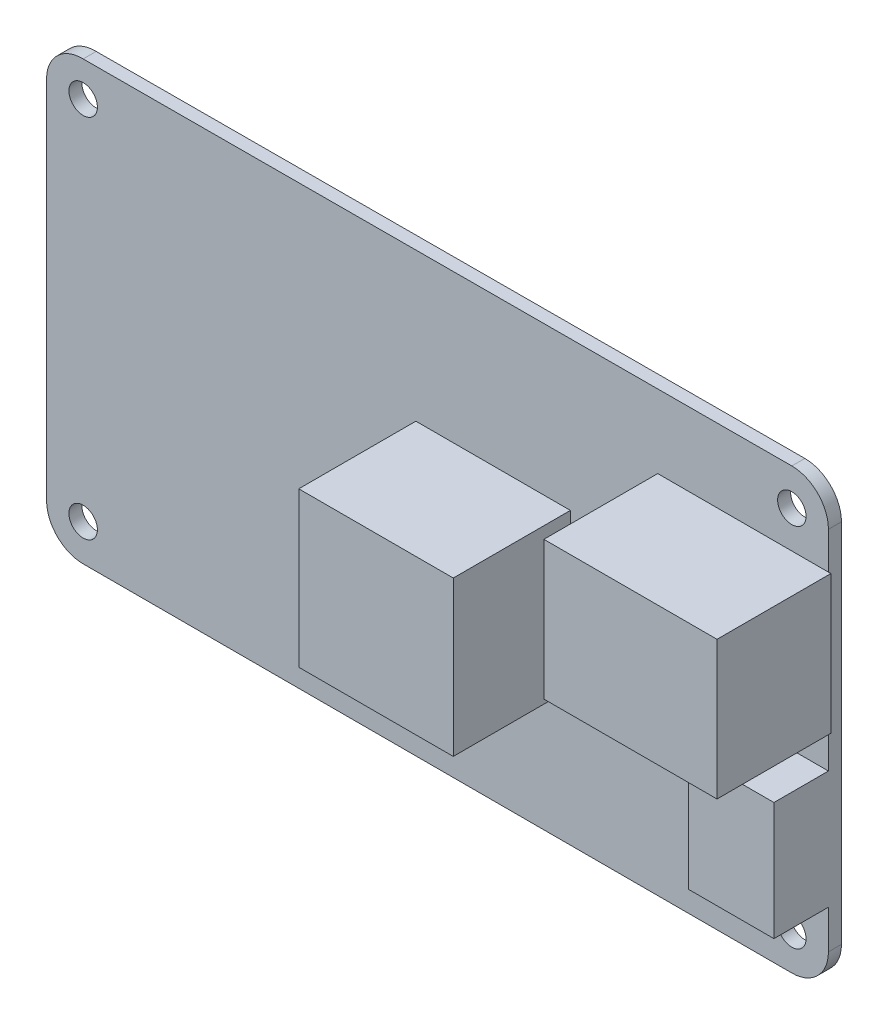
ISO-10303-21;
HEADER;
FILE_DESCRIPTION(('STEP AP214'),'2;1');
FILE_NAME('part.step','',(''),(''),'','','');
FILE_SCHEMA(('AUTOMOTIVE_DESIGN { 1 0 10303 214 1 1 1 1 }'));
ENDSEC;
DATA;
#1=APPLICATION_CONTEXT('core data for automotive mechanical design processes');
#2=APPLICATION_PROTOCOL_DEFINITION('international standard','automotive_design',2000,#1);
#3=PRODUCT_CONTEXT('',#1,'mechanical');
#4=PRODUCT('Part','Part','',(#3));
#5=PRODUCT_RELATED_PRODUCT_CATEGORY('part','',(#4));
#6=PRODUCT_DEFINITION_FORMATION('','',#4);
#7=PRODUCT_DEFINITION_CONTEXT('part definition',#1,'design');
#8=PRODUCT_DEFINITION('design','',#6,#7);
#9=PRODUCT_DEFINITION_SHAPE('','',#8);
#10=(LENGTH_UNIT() NAMED_UNIT(*) SI_UNIT(.MILLI.,.METRE.));
#11=(NAMED_UNIT(*) PLANE_ANGLE_UNIT() SI_UNIT($,.RADIAN.));
#12=(NAMED_UNIT(*) SI_UNIT($,.STERADIAN.) SOLID_ANGLE_UNIT());
#13=UNCERTAINTY_MEASURE_WITH_UNIT(LENGTH_MEASURE(1.E-05),#10,'distance_accuracy_value','');
#14=(GEOMETRIC_REPRESENTATION_CONTEXT(3) GLOBAL_UNCERTAINTY_ASSIGNED_CONTEXT((#13)) GLOBAL_UNIT_ASSIGNED_CONTEXT((#10,
#11,#12)) REPRESENTATION_CONTEXT('',''));
#15=CARTESIAN_POINT('',(0.,0.,0.));
#16=DIRECTION('',(0.,0.,1.));
#17=DIRECTION('',(1.,0.,0.));
#18=AXIS2_PLACEMENT_3D('',#15,#16,#17);
#19=CARTESIAN_POINT('',(87.3508295780182,-136.451333310687,-29.8283937748464));
#20=DIRECTION('',(0.,0.,1.));
#21=DIRECTION('',(1.,0.,0.));
#22=AXIS2_PLACEMENT_3D('',#19,#20,#21);
#23=PLANE('',#22);
#24=CARTESIAN_POINT('',(0.210829578018185,-91.4513333106873,-29.8283937748464));
#25=DIRECTION('',(0.,0.,1.));
#26=DIRECTION('',(1.,0.,0.));
#27=AXIS2_PLACEMENT_3D('',#24,#25,#26);
#28=CIRCLE('',#27,1.75);
#29=CARTESIAN_POINT('',(1.96082957801818,-91.4513333106873,-29.8283937748464));
#30=VERTEX_POINT('',#29);
#31=EDGE_CURVE('E279',#30,#30,#28,.T.);
#32=ORIENTED_EDGE('',*,*,#31,.F.);
#33=EDGE_LOOP('',(#32));
#34=FACE_BOUND('',#33,.T.);
#35=CARTESIAN_POINT('',(87.3508295780182,-136.451333310687,-29.8283937748464));
#36=DIRECTION('',(0.,0.,1.));
#37=DIRECTION('',(1.,0.,0.));
#38=AXIS2_PLACEMENT_3D('',#35,#36,#37);
#39=CIRCLE('',#38,1.75);
#40=CARTESIAN_POINT('',(89.1008295780182,-136.451333310687,-29.8283937748464));
#41=VERTEX_POINT('',#40);
#42=EDGE_CURVE('E291',#41,#41,#39,.T.);
#43=ORIENTED_EDGE('',*,*,#42,.F.);
#44=EDGE_LOOP('',(#43));
#45=FACE_BOUND('',#44,.T.);
#46=CARTESIAN_POINT('',(87.3508295780182,-91.4513333106873,-29.8283937748464));
#47=DIRECTION('',(0.,0.,1.));
#48=DIRECTION('',(1.,0.,0.));
#49=AXIS2_PLACEMENT_3D('',#46,#47,#48);
#50=CIRCLE('',#49,1.75);
#51=CARTESIAN_POINT('',(89.1008295780182,-91.4513333106873,-29.8283937748464));
#52=VERTEX_POINT('',#51);
#53=EDGE_CURVE('E285',#52,#52,#50,.T.);
#54=ORIENTED_EDGE('',*,*,#53,.F.);
#55=EDGE_LOOP('',(#54));
#56=FACE_BOUND('',#55,.T.);
#57=CARTESIAN_POINT('',(0.210829578018185,-136.451333310687,-29.8283937748464));
#58=DIRECTION('',(0.,0.,1.));
#59=DIRECTION('',(1.,0.,0.));
#60=AXIS2_PLACEMENT_3D('',#57,#58,#59);
#61=CIRCLE('',#60,1.75);
#62=CARTESIAN_POINT('',(1.96082957801819,-136.451333310687,-29.8283937748464));
#63=VERTEX_POINT('',#62);
#64=EDGE_CURVE('E273',#63,#63,#61,.T.);
#65=ORIENTED_EDGE('',*,*,#64,.F.);
#66=EDGE_LOOP('',(#65));
#67=FACE_BOUND('',#66,.T.);
#68=DIRECTION('',(0.,-1.,0.));
#69=VECTOR('',#68,1.);
#70=CARTESIAN_POINT('',(81.3508295780182,-131.691333310687,-29.8283937748464));
#71=LINE('',#70,#69);
#72=CARTESIAN_POINT('',(81.3508295780182,-117.191333310687,-29.8283937748464));
#73=VERTEX_POINT('',#72);
#74=CARTESIAN_POINT('',(81.3508295780182,-131.691333310687,-29.8283937748464));
#75=VERTEX_POINT('',#74);
#76=EDGE_CURVE('E64',#73,#75,#71,.T.);
#77=ORIENTED_EDGE('',*,*,#76,.F.);
#78=DIRECTION('',(-1.,0.,0.));
#79=VECTOR('',#78,1.);
#80=CARTESIAN_POINT('',(91.8508295780181,-117.191333310687,-29.8283937748464));
#81=LINE('',#80,#79);
#82=CARTESIAN_POINT('',(91.8508295780181,-117.191333310687,-29.8283937748464));
#83=VERTEX_POINT('',#82);
#84=EDGE_CURVE('E210',#83,#73,#81,.T.);
#85=ORIENTED_EDGE('',*,*,#84,.F.);
#86=DIRECTION('',(0.,1.,0.));
#87=VECTOR('',#86,1.);
#88=CARTESIAN_POINT('',(91.8508295780182,-91.4513333106873,-29.8283937748464));
#89=LINE('',#88,#87);
#90=CARTESIAN_POINT('',(91.8508295780182,-113.021333310687,-29.8283937748464));
#91=VERTEX_POINT('',#90);
#92=EDGE_CURVE('E305',#83,#91,#89,.T.);
#93=ORIENTED_EDGE('',*,*,#92,.T.);
#94=DIRECTION('',(1.,0.,0.));
#95=VECTOR('',#94,1.);
#96=CARTESIAN_POINT('',(70.8608295780182,-113.021333310687,-29.8283937748464));
#97=LINE('',#96,#95);
#98=CARTESIAN_POINT('',(70.8608295780182,-113.021333310687,-29.8283937748464));
#99=VERTEX_POINT('',#98);
#100=EDGE_CURVE('E255',#99,#91,#97,.T.);
#101=ORIENTED_EDGE('',*,*,#100,.F.);
#102=DIRECTION('',(0.,-1.,0.));
#103=VECTOR('',#102,1.);
#104=CARTESIAN_POINT('',(70.8608295780182,-113.021333310687,-29.8283937748464));
#105=LINE('',#104,#103);
#106=CARTESIAN_POINT('',(70.8608295780182,-96.0113333106873,-29.8283937748464));
#107=VERTEX_POINT('',#106);
#108=EDGE_CURVE('E241',#107,#99,#105,.T.);
#109=ORIENTED_EDGE('',*,*,#108,.F.);
#110=DIRECTION('',(-1.,0.,0.));
#111=VECTOR('',#110,1.);
#112=CARTESIAN_POINT('',(70.8608295780182,-96.0113333106873,-29.8283937748464));
#113=LINE('',#112,#111);
#114=CARTESIAN_POINT('',(91.8508295780182,-96.0113333106873,-29.8283937748464));
#115=VERTEX_POINT('',#114);
#116=EDGE_CURVE('E11',#115,#107,#113,.T.);
#117=ORIENTED_EDGE('',*,*,#116,.F.);
#118=CARTESIAN_POINT('',(91.8508295780182,-91.4513333106873,-29.8283937748464));
#119=VERTEX_POINT('',#118);
#120=EDGE_CURVE('E300',#115,#119,#89,.T.);
#121=ORIENTED_EDGE('',*,*,#120,.T.);
#122=CARTESIAN_POINT('',(87.3508295780182,-91.4513333106873,-29.8283937748464));
#123=DIRECTION('',(0.,0.,1.));
#124=DIRECTION('',(-1.,0.,0.));
#125=AXIS2_PLACEMENT_3D('',#122,#123,#124);
#126=CIRCLE('',#125,4.49999999999998);
#127=CARTESIAN_POINT('',(87.3508295780182,-86.9513333106873,-29.8283937748464));
#128=VERTEX_POINT('',#127);
#129=EDGE_CURVE('E304',#119,#128,#126,.T.);
#130=ORIENTED_EDGE('',*,*,#129,.T.);
#131=DIRECTION('',(-0.999996529366138,-0.00263462628827098,0.));
#132=VECTOR('',#131,1.);
#133=CARTESIAN_POINT('',(87.3508295780182,-86.9513333106873,-29.8283937748464));
#134=LINE('',#133,#132);
#135=CARTESIAN_POINT('',(0.210829578018185,-87.1809154422427,-29.8283937748464));
#136=VERTEX_POINT('',#135);
#137=EDGE_CURVE('E308',#128,#136,#134,.T.);
#138=ORIENTED_EDGE('',*,*,#137,.T.);
#139=CARTESIAN_POINT('',(0.0960385122404962,-91.5661243764651,-29.8283937748464));
#140=DIRECTION('',(0.,0.,1.));
#141=DIRECTION('',(-1.,0.,0.));
#142=AXIS2_PLACEMENT_3D('',#139,#140,#141);
#143=CIRCLE('',#142,4.38671111261792);
#144=CARTESIAN_POINT('',(-4.28917042198182,-91.4513333106873,-29.8283937748464));
#145=VERTEX_POINT('',#144);
#146=EDGE_CURVE('E310',#136,#145,#143,.T.);
#147=ORIENTED_EDGE('',*,*,#146,.T.);
#148=DIRECTION('',(0.,-1.,0.));
#149=VECTOR('',#148,1.);
#150=CARTESIAN_POINT('',(-4.28917042198179,-136.451333310687,-29.8283937748464));
#151=LINE('',#150,#149);
#152=CARTESIAN_POINT('',(-4.28917042198178,-136.451333310687,-29.8283937748464));
#153=VERTEX_POINT('',#152);
#154=EDGE_CURVE('E312',#145,#153,#151,.T.);
#155=ORIENTED_EDGE('',*,*,#154,.T.);
#156=CARTESIAN_POINT('',(0.21082957801823,-136.451333310687,-29.8283937748464));
#157=DIRECTION('',(0.,0.,1.));
#158=DIRECTION('',(1.,0.,0.));
#159=AXIS2_PLACEMENT_3D('',#156,#157,#158);
#160=CIRCLE('',#159,4.50000000000001);
#161=CARTESIAN_POINT('',(0.210829578018185,-140.951333310687,-29.8283937748464));
#162=VERTEX_POINT('',#161);
#163=EDGE_CURVE('E314',#153,#162,#160,.T.);
#164=ORIENTED_EDGE('',*,*,#163,.T.);
#165=DIRECTION('',(1.,0.,0.));
#166=VECTOR('',#165,1.);
#167=CARTESIAN_POINT('',(87.3508295780182,-140.951333310687,-29.8283937748464));
#168=LINE('',#167,#166);
#169=CARTESIAN_POINT('',(87.3508295780182,-140.951333310687,-29.8283937748464));
#170=VERTEX_POINT('',#169);
#171=EDGE_CURVE('E316',#162,#170,#168,.T.);
#172=ORIENTED_EDGE('',*,*,#171,.T.);
#173=CARTESIAN_POINT('',(87.3508295780182,-136.451333310687,-29.8283937748464));
#174=DIRECTION('',(0.,0.,1.));
#175=DIRECTION('',(1.,0.,0.));
#176=AXIS2_PLACEMENT_3D('',#173,#174,#175);
#177=CIRCLE('',#176,4.49999999999998);
#178=CARTESIAN_POINT('',(91.8508295780181,-136.451333310687,-29.8283937748464));
#179=VERTEX_POINT('',#178);
#180=EDGE_CURVE('E297',#170,#179,#177,.T.);
#181=ORIENTED_EDGE('',*,*,#180,.T.);
#182=CARTESIAN_POINT('',(91.8508295780181,-131.691333310687,-29.8283937748464));
#183=VERTEX_POINT('',#182);
#184=EDGE_CURVE('E302',#179,#183,#89,.T.);
#185=ORIENTED_EDGE('',*,*,#184,.T.);
#186=DIRECTION('',(1.,0.,0.));
#187=VECTOR('',#186,1.);
#188=CARTESIAN_POINT('',(91.8508295780181,-131.691333310687,-29.8283937748464));
#189=LINE('',#188,#187);
#190=EDGE_CURVE('E220',#75,#183,#189,.T.);
#191=ORIENTED_EDGE('',*,*,#190,.F.);
#192=EDGE_LOOP('',(#77,#85,#93,#101,#109,#117,#121,#130,#138,#147,#155,#164,#172,#181,#185,#191));
#193=FACE_BOUND('',#192,.T.);
#194=DIRECTION('',(-1.,0.,0.));
#195=VECTOR('',#194,1.);
#196=CARTESIAN_POINT('',(60.1208295780182,-105.302468160602,-29.8283937748464));
#197=LINE('',#196,#195);
#198=CARTESIAN_POINT('',(60.1208295780182,-105.302468160602,-29.8283937748464));
#199=VERTEX_POINT('',#198);
#200=CARTESIAN_POINT('',(41.1208295780182,-105.302468160602,-29.8283937748464));
#201=VERTEX_POINT('',#200);
#202=EDGE_CURVE('E656',#199,#201,#197,.T.);
#203=ORIENTED_EDGE('',*,*,#202,.F.);
#204=DIRECTION('',(0.,1.,0.));
#205=VECTOR('',#204,1.);
#206=CARTESIAN_POINT('',(60.1208295780182,-124.302468160602,-29.8283937748464));
#207=LINE('',#206,#205);
#208=CARTESIAN_POINT('',(60.1208295780182,-124.302468160602,-29.8283937748464));
#209=VERTEX_POINT('',#208);
#210=EDGE_CURVE('E208',#209,#199,#207,.T.);
#211=ORIENTED_EDGE('',*,*,#210,.F.);
#212=DIRECTION('',(1.,0.,0.));
#213=VECTOR('',#212,1.);
#214=CARTESIAN_POINT('',(60.1208295780182,-124.302468160602,-29.8283937748464));
#215=LINE('',#214,#213);
#216=CARTESIAN_POINT('',(41.1208295780182,-124.302468160602,-29.8283937748464));
#217=VERTEX_POINT('',#216);
#218=EDGE_CURVE('E204',#217,#209,#215,.T.);
#219=ORIENTED_EDGE('',*,*,#218,.F.);
#220=DIRECTION('',(0.,-1.,0.));
#221=VECTOR('',#220,1.);
#222=CARTESIAN_POINT('',(41.1208295780182,-124.302468160602,-29.8283937748464));
#223=LINE('',#222,#221);
#224=EDGE_CURVE('E653',#201,#217,#223,.T.);
#225=ORIENTED_EDGE('',*,*,#224,.F.);
#226=EDGE_LOOP('',(#203,#211,#219,#225));
#227=FACE_BOUND('',#226,.T.);
#228=ADVANCED_FACE('F39',(#34,#45,#56,#67,#193,#227),#23,.T.);
#229=CARTESIAN_POINT('',(87.3508295780182,-136.451333310687,-31.4283937748464));
#230=DIRECTION('',(0.,0.,1.));
#231=DIRECTION('',(1.,0.,0.));
#232=AXIS2_PLACEMENT_3D('',#229,#230,#231);
#233=PLANE('',#232);
#234=CARTESIAN_POINT('',(87.3508295780182,-136.451333310687,-31.4283937748464));
#235=DIRECTION('',(0.,0.,1.));
#236=DIRECTION('',(1.,0.,0.));
#237=AXIS2_PLACEMENT_3D('',#234,#235,#236);
#238=CIRCLE('',#237,4.49999999999998);
#239=CARTESIAN_POINT('',(87.3508295780182,-140.951333310687,-31.4283937748464));
#240=VERTEX_POINT('',#239);
#241=CARTESIAN_POINT('',(91.8508295780181,-136.451333310687,-31.4283937748464));
#242=VERTEX_POINT('',#241);
#243=EDGE_CURVE('E294',#240,#242,#238,.T.);
#244=ORIENTED_EDGE('',*,*,#243,.F.);
#245=DIRECTION('',(1.,0.,0.));
#246=VECTOR('',#245,1.);
#247=CARTESIAN_POINT('',(87.3508295780182,-140.951333310687,-31.4283937748464));
#248=LINE('',#247,#246);
#249=CARTESIAN_POINT('',(0.210829578018185,-140.951333310687,-31.4283937748464));
#250=VERTEX_POINT('',#249);
#251=EDGE_CURVE('E301',#250,#240,#248,.T.);
#252=ORIENTED_EDGE('',*,*,#251,.F.);
#253=CARTESIAN_POINT('',(0.21082957801823,-136.451333310687,-31.4283937748464));
#254=DIRECTION('',(0.,0.,1.));
#255=DIRECTION('',(1.,0.,0.));
#256=AXIS2_PLACEMENT_3D('',#253,#254,#255);
#257=CIRCLE('',#256,4.50000000000001);
#258=CARTESIAN_POINT('',(-4.28917042198178,-136.451333310687,-31.4283937748464));
#259=VERTEX_POINT('',#258);
#260=EDGE_CURVE('E331',#259,#250,#257,.T.);
#261=ORIENTED_EDGE('',*,*,#260,.F.);
#262=DIRECTION('',(0.,-1.,0.));
#263=VECTOR('',#262,1.);
#264=CARTESIAN_POINT('',(-4.28917042198179,-136.451333310687,-31.4283937748464));
#265=LINE('',#264,#263);
#266=CARTESIAN_POINT('',(-4.28917042198182,-91.4513333106873,-31.4283937748464));
#267=VERTEX_POINT('',#266);
#268=EDGE_CURVE('E329',#267,#259,#265,.T.);
#269=ORIENTED_EDGE('',*,*,#268,.F.);
#270=CARTESIAN_POINT('',(0.0960385122404962,-91.5661243764651,-31.4283937748464));
#271=DIRECTION('',(0.,0.,1.));
#272=DIRECTION('',(-1.,0.,0.));
#273=AXIS2_PLACEMENT_3D('',#270,#271,#272);
#274=CIRCLE('',#273,4.38671111261792);
#275=CARTESIAN_POINT('',(0.210829578018185,-87.1809154422427,-31.4283937748464));
#276=VERTEX_POINT('',#275);
#277=EDGE_CURVE('E327',#276,#267,#274,.T.);
#278=ORIENTED_EDGE('',*,*,#277,.F.);
#279=DIRECTION('',(-0.999996529366138,-0.00263462628827098,0.));
#280=VECTOR('',#279,1.);
#281=CARTESIAN_POINT('',(87.3508295780182,-86.9513333106873,-31.4283937748464));
#282=LINE('',#281,#280);
#283=CARTESIAN_POINT('',(87.3508295780182,-86.9513333106873,-31.4283937748464));
#284=VERTEX_POINT('',#283);
#285=EDGE_CURVE('E325',#284,#276,#282,.T.);
#286=ORIENTED_EDGE('',*,*,#285,.F.);
#287=CARTESIAN_POINT('',(87.3508295780182,-91.4513333106873,-31.4283937748464));
#288=DIRECTION('',(0.,0.,1.));
#289=DIRECTION('',(-1.,0.,0.));
#290=AXIS2_PLACEMENT_3D('',#287,#288,#289);
#291=CIRCLE('',#290,4.49999999999998);
#292=CARTESIAN_POINT('',(91.8508295780182,-91.4513333106873,-31.4283937748464));
#293=VERTEX_POINT('',#292);
#294=EDGE_CURVE('E323',#293,#284,#291,.T.);
#295=ORIENTED_EDGE('',*,*,#294,.F.);
#296=DIRECTION('',(0.,1.,0.));
#297=VECTOR('',#296,1.);
#298=CARTESIAN_POINT('',(91.8508295780182,-91.4513333106873,-31.4283937748464));
#299=LINE('',#298,#297);
#300=EDGE_CURVE('E321',#242,#293,#299,.T.);
#301=ORIENTED_EDGE('',*,*,#300,.F.);
#302=EDGE_LOOP('',(#244,#252,#261,#269,#278,#286,#295,#301));
#303=FACE_BOUND('',#302,.T.);
#304=CARTESIAN_POINT('',(87.3508295780182,-136.451333310687,-31.4283937748464));
#305=DIRECTION('',(0.,0.,1.));
#306=DIRECTION('',(1.,0.,0.));
#307=AXIS2_PLACEMENT_3D('',#304,#305,#306);
#308=CIRCLE('',#307,1.75);
#309=CARTESIAN_POINT('',(89.1008295780182,-136.451333310687,-31.4283937748464));
#310=VERTEX_POINT('',#309);
#311=EDGE_CURVE('E288',#310,#310,#308,.T.);
#312=ORIENTED_EDGE('',*,*,#311,.T.);
#313=EDGE_LOOP('',(#312));
#314=FACE_BOUND('',#313,.T.);
#315=CARTESIAN_POINT('',(87.3508295780182,-91.4513333106873,-31.4283937748464));
#316=DIRECTION('',(0.,0.,1.));
#317=DIRECTION('',(1.,0.,0.));
#318=AXIS2_PLACEMENT_3D('',#315,#316,#317);
#319=CIRCLE('',#318,1.75);
#320=CARTESIAN_POINT('',(89.1008295780182,-91.4513333106873,-31.4283937748464));
#321=VERTEX_POINT('',#320);
#322=EDGE_CURVE('E282',#321,#321,#319,.T.);
#323=ORIENTED_EDGE('',*,*,#322,.T.);
#324=EDGE_LOOP('',(#323));
#325=FACE_BOUND('',#324,.T.);
#326=CARTESIAN_POINT('',(0.210829578018185,-91.4513333106873,-31.4283937748464));
#327=DIRECTION('',(0.,0.,1.));
#328=DIRECTION('',(1.,0.,0.));
#329=AXIS2_PLACEMENT_3D('',#326,#327,#328);
#330=CIRCLE('',#329,1.75);
#331=CARTESIAN_POINT('',(1.96082957801818,-91.4513333106873,-31.4283937748464));
#332=VERTEX_POINT('',#331);
#333=EDGE_CURVE('E276',#332,#332,#330,.T.);
#334=ORIENTED_EDGE('',*,*,#333,.T.);
#335=EDGE_LOOP('',(#334));
#336=FACE_BOUND('',#335,.T.);
#337=CARTESIAN_POINT('',(0.210829578018185,-136.451333310687,-31.4283937748464));
#338=DIRECTION('',(0.,0.,1.));
#339=DIRECTION('',(1.,0.,0.));
#340=AXIS2_PLACEMENT_3D('',#337,#338,#339);
#341=CIRCLE('',#340,1.75);
#342=CARTESIAN_POINT('',(1.96082957801819,-136.451333310687,-31.4283937748464));
#343=VERTEX_POINT('',#342);
#344=EDGE_CURVE('E272',#343,#343,#341,.T.);
#345=ORIENTED_EDGE('',*,*,#344,.T.);
#346=EDGE_LOOP('',(#345));
#347=FACE_BOUND('',#346,.T.);
#348=ADVANCED_FACE('F366',(#303,#314,#325,#336,#347),#233,.F.);
#349=CARTESIAN_POINT('',(87.3508295780182,-136.451333310687,-29.8283937748464));
#350=DIRECTION('',(0.,0.,-1.));
#351=DIRECTION('',(-1.,0.,0.));
#352=AXIS2_PLACEMENT_3D('',#349,#350,#351);
#353=CYLINDRICAL_SURFACE('',#352,4.49999999999998);
#354=ORIENTED_EDGE('',*,*,#243,.T.);
#355=DIRECTION('',(0.,0.,-1.));
#356=VECTOR('',#355,1.);
#357=CARTESIAN_POINT('',(91.8508295780181,-136.451333310687,-29.8283937748464));
#358=LINE('',#357,#356);
#359=EDGE_CURVE('E43',#179,#242,#358,.T.);
#360=ORIENTED_EDGE('',*,*,#359,.F.);
#361=ORIENTED_EDGE('',*,*,#180,.F.);
#362=DIRECTION('',(0.,0.,-1.));
#363=VECTOR('',#362,1.);
#364=CARTESIAN_POINT('',(87.3508295780182,-140.951333310687,-29.8283937748464));
#365=LINE('',#364,#363);
#366=EDGE_CURVE('E318',#170,#240,#365,.T.);
#367=ORIENTED_EDGE('',*,*,#366,.T.);
#368=EDGE_LOOP('',(#354,#360,#361,#367));
#369=FACE_BOUND('',#368,.T.);
#370=ADVANCED_FACE('F41',(#369),#353,.T.);
#371=CARTESIAN_POINT('',(91.8508295780182,-91.4513333106873,-29.8283937748464));
#372=DIRECTION('',(-1.,0.,0.));
#373=DIRECTION('',(0.,-1.,0.));
#374=AXIS2_PLACEMENT_3D('',#371,#372,#373);
#375=PLANE('',#374);
#376=ORIENTED_EDGE('',*,*,#300,.T.);
#377=DIRECTION('',(0.,0.,-1.));
#378=VECTOR('',#377,1.);
#379=CARTESIAN_POINT('',(91.8508295780182,-91.4513333106873,-29.8283937748464));
#380=LINE('',#379,#378);
#381=EDGE_CURVE('E350',#119,#293,#380,.T.);
#382=ORIENTED_EDGE('',*,*,#381,.F.);
#383=ORIENTED_EDGE('',*,*,#120,.F.);
#384=EDGE_CURVE('E306',#91,#115,#89,.T.);
#385=ORIENTED_EDGE('',*,*,#384,.F.);
#386=ORIENTED_EDGE('',*,*,#92,.F.);
#387=DIRECTION('',(0.,0.,-1.));
#388=VECTOR('',#387,1.);
#389=CARTESIAN_POINT('',(91.8508295780181,-117.191333310687,-23.1283937748464));
#390=LINE('',#389,#388);
#391=CARTESIAN_POINT('',(91.8508295780181,-117.191333310687,-23.1283937748464));
#392=VERTEX_POINT('',#391);
#393=EDGE_CURVE('E238',#392,#83,#390,.T.);
#394=ORIENTED_EDGE('',*,*,#393,.F.);
#395=DIRECTION('',(0.,1.,0.));
#396=VECTOR('',#395,1.);
#397=CARTESIAN_POINT('',(91.8508295780181,-131.691333310687,-23.1283937748464));
#398=LINE('',#397,#396);
#399=CARTESIAN_POINT('',(91.8508295780181,-131.691333310687,-23.1283937748464));
#400=VERTEX_POINT('',#399);
#401=EDGE_CURVE('E216',#400,#392,#398,.T.);
#402=ORIENTED_EDGE('',*,*,#401,.F.);
#403=DIRECTION('',(0.,0.,-1.));
#404=VECTOR('',#403,1.);
#405=CARTESIAN_POINT('',(91.8508295780181,-131.691333310687,-23.1283937748464));
#406=LINE('',#405,#404);
#407=EDGE_CURVE('E225',#400,#183,#406,.T.);
#408=ORIENTED_EDGE('',*,*,#407,.T.);
#409=ORIENTED_EDGE('',*,*,#184,.F.);
#410=ORIENTED_EDGE('',*,*,#359,.T.);
#411=EDGE_LOOP('',(#376,#382,#383,#385,#386,#394,#402,#408,#409,#410));
#412=FACE_BOUND('',#411,.T.);
#413=ADVANCED_FACE('F359',(#412),#375,.F.);
#414=CARTESIAN_POINT('',(87.3508295780182,-91.4513333106873,-29.8283937748464));
#415=DIRECTION('',(0.,0.,-1.));
#416=DIRECTION('',(-1.,0.,0.));
#417=AXIS2_PLACEMENT_3D('',#414,#415,#416);
#418=CYLINDRICAL_SURFACE('',#417,4.49999999999998);
#419=ORIENTED_EDGE('',*,*,#294,.T.);
#420=DIRECTION('',(0.,0.,-1.));
#421=VECTOR('',#420,1.);
#422=CARTESIAN_POINT('',(87.3508295780182,-86.9513333106873,-29.8283937748464));
#423=LINE('',#422,#421);
#424=EDGE_CURVE('E348',#128,#284,#423,.T.);
#425=ORIENTED_EDGE('',*,*,#424,.F.);
#426=ORIENTED_EDGE('',*,*,#129,.F.);
#427=ORIENTED_EDGE('',*,*,#381,.T.);
#428=EDGE_LOOP('',(#419,#425,#426,#427));
#429=FACE_BOUND('',#428,.T.);
#430=ADVANCED_FACE('F372',(#429),#418,.T.);
#431=CARTESIAN_POINT('',(87.3508295780182,-86.9513333106873,-29.8283937748464));
#432=DIRECTION('',(0.00263462628827098,-0.999996529366138,0.));
#433=DIRECTION('',(0.999996529366138,0.00263462628827098,0.));
#434=AXIS2_PLACEMENT_3D('',#431,#432,#433);
#435=PLANE('',#434);
#436=ORIENTED_EDGE('',*,*,#285,.T.);
#437=DIRECTION('',(0.,0.,-1.));
#438=VECTOR('',#437,1.);
#439=CARTESIAN_POINT('',(0.210829578018185,-87.1809154422427,-29.8283937748464));
#440=LINE('',#439,#438);
#441=EDGE_CURVE('E345',#136,#276,#440,.T.);
#442=ORIENTED_EDGE('',*,*,#441,.F.);
#443=ORIENTED_EDGE('',*,*,#137,.F.);
#444=ORIENTED_EDGE('',*,*,#424,.T.);
#445=EDGE_LOOP('',(#436,#442,#443,#444));
#446=FACE_BOUND('',#445,.T.);
#447=ADVANCED_FACE('F375',(#446),#435,.F.);
#448=CARTESIAN_POINT('',(0.0960385122404962,-91.5661243764651,-29.8283937748464));
#449=DIRECTION('',(0.,0.,-1.));
#450=DIRECTION('',(-1.,0.,0.));
#451=AXIS2_PLACEMENT_3D('',#448,#449,#450);
#452=CYLINDRICAL_SURFACE('',#451,4.38671111261792);
#453=ORIENTED_EDGE('',*,*,#277,.T.);
#454=DIRECTION('',(0.,0.,-1.));
#455=VECTOR('',#454,1.);
#456=CARTESIAN_POINT('',(-4.28917042198182,-91.4513333106873,-29.8283937748464));
#457=LINE('',#456,#455);
#458=EDGE_CURVE('E342',#145,#267,#457,.T.);
#459=ORIENTED_EDGE('',*,*,#458,.F.);
#460=ORIENTED_EDGE('',*,*,#146,.F.);
#461=ORIENTED_EDGE('',*,*,#441,.T.);
#462=EDGE_LOOP('',(#453,#459,#460,#461));
#463=FACE_BOUND('',#462,.T.);
#464=ADVANCED_FACE('F442',(#463),#452,.T.);
#465=CARTESIAN_POINT('',(-4.28917042198179,-136.451333310687,-29.8283937748464));
#466=DIRECTION('',(1.,0.,0.));
#467=DIRECTION('',(0.,1.,0.));
#468=AXIS2_PLACEMENT_3D('',#465,#466,#467);
#469=PLANE('',#468);
#470=ORIENTED_EDGE('',*,*,#268,.T.);
#471=DIRECTION('',(0.,0.,-1.));
#472=VECTOR('',#471,1.);
#473=CARTESIAN_POINT('',(-4.28917042198178,-136.451333310687,-29.8283937748464));
#474=LINE('',#473,#472);
#475=EDGE_CURVE('E339',#153,#259,#474,.T.);
#476=ORIENTED_EDGE('',*,*,#475,.F.);
#477=ORIENTED_EDGE('',*,*,#154,.F.);
#478=ORIENTED_EDGE('',*,*,#458,.T.);
#479=EDGE_LOOP('',(#470,#476,#477,#478));
#480=FACE_BOUND('',#479,.T.);
#481=ADVANCED_FACE('F438',(#480),#469,.F.);
#482=CARTESIAN_POINT('',(0.21082957801823,-136.451333310687,-29.8283937748464));
#483=DIRECTION('',(0.,0.,-1.));
#484=DIRECTION('',(-1.,0.,0.));
#485=AXIS2_PLACEMENT_3D('',#482,#483,#484);
#486=CYLINDRICAL_SURFACE('',#485,4.50000000000001);
#487=ORIENTED_EDGE('',*,*,#260,.T.);
#488=DIRECTION('',(0.,0.,-1.));
#489=VECTOR('',#488,1.);
#490=CARTESIAN_POINT('',(0.210829578018185,-140.951333310687,-29.8283937748464));
#491=LINE('',#490,#489);
#492=EDGE_CURVE('E336',#162,#250,#491,.T.);
#493=ORIENTED_EDGE('',*,*,#492,.F.);
#494=ORIENTED_EDGE('',*,*,#163,.F.);
#495=ORIENTED_EDGE('',*,*,#475,.T.);
#496=EDGE_LOOP('',(#487,#493,#494,#495));
#497=FACE_BOUND('',#496,.T.);
#498=ADVANCED_FACE('F434',(#497),#486,.T.);
#499=CARTESIAN_POINT('',(87.3508295780182,-140.951333310687,-29.8283937748464));
#500=DIRECTION('',(0.,1.,0.));
#501=DIRECTION('',(0.,0.,1.));
#502=AXIS2_PLACEMENT_3D('',#499,#500,#501);
#503=PLANE('',#502);
#504=ORIENTED_EDGE('',*,*,#251,.T.);
#505=ORIENTED_EDGE('',*,*,#366,.F.);
#506=ORIENTED_EDGE('',*,*,#171,.F.);
#507=ORIENTED_EDGE('',*,*,#492,.T.);
#508=EDGE_LOOP('',(#504,#505,#506,#507));
#509=FACE_BOUND('',#508,.T.);
#510=ADVANCED_FACE('F431',(#509),#503,.F.);
#511=CARTESIAN_POINT('',(87.3508295780182,-136.451333310687,-29.8283937748464));
#512=DIRECTION('',(0.,0.,-1.));
#513=DIRECTION('',(-1.,0.,0.));
#514=AXIS2_PLACEMENT_3D('',#511,#512,#513);
#515=CYLINDRICAL_SURFACE('',#514,1.75);
#516=ORIENTED_EDGE('',*,*,#42,.T.);
#517=EDGE_LOOP('',(#516));
#518=FACE_BOUND('',#517,.T.);
#519=ORIENTED_EDGE('',*,*,#311,.F.);
#520=EDGE_LOOP('',(#519));
#521=FACE_BOUND('',#520,.T.);
#522=ADVANCED_FACE('F428',(#518,#521),#515,.F.);
#523=CARTESIAN_POINT('',(87.3508295780182,-91.4513333106873,-29.8283937748464));
#524=DIRECTION('',(0.,0.,-1.));
#525=DIRECTION('',(-1.,0.,0.));
#526=AXIS2_PLACEMENT_3D('',#523,#524,#525);
#527=CYLINDRICAL_SURFACE('',#526,1.75);
#528=ORIENTED_EDGE('',*,*,#53,.T.);
#529=EDGE_LOOP('',(#528));
#530=FACE_BOUND('',#529,.T.);
#531=ORIENTED_EDGE('',*,*,#322,.F.);
#532=EDGE_LOOP('',(#531));
#533=FACE_BOUND('',#532,.T.);
#534=ADVANCED_FACE('F497',(#530,#533),#527,.F.);
#535=CARTESIAN_POINT('',(0.210829578018185,-91.4513333106873,-29.8283937748464));
#536=DIRECTION('',(0.,0.,-1.));
#537=DIRECTION('',(-1.,0.,0.));
#538=AXIS2_PLACEMENT_3D('',#535,#536,#537);
#539=CYLINDRICAL_SURFACE('',#538,1.75);
#540=ORIENTED_EDGE('',*,*,#31,.T.);
#541=EDGE_LOOP('',(#540));
#542=FACE_BOUND('',#541,.T.);
#543=ORIENTED_EDGE('',*,*,#333,.F.);
#544=EDGE_LOOP('',(#543));
#545=FACE_BOUND('',#544,.T.);
#546=ADVANCED_FACE('F505',(#542,#545),#539,.F.);
#547=CARTESIAN_POINT('',(0.210829578018185,-136.451333310687,-29.8283937748464));
#548=DIRECTION('',(0.,0.,-1.));
#549=DIRECTION('',(-1.,0.,0.));
#550=AXIS2_PLACEMENT_3D('',#547,#548,#549);
#551=CYLINDRICAL_SURFACE('',#550,1.75);
#552=ORIENTED_EDGE('',*,*,#64,.T.);
#553=EDGE_LOOP('',(#552));
#554=FACE_BOUND('',#553,.T.);
#555=ORIENTED_EDGE('',*,*,#344,.F.);
#556=EDGE_LOOP('',(#555));
#557=FACE_BOUND('',#556,.T.);
#558=ADVANCED_FACE('F513',(#554,#557),#551,.F.);
#559=CARTESIAN_POINT('',(70.8608295780182,-113.021333310687,-15.8283937748464));
#560=DIRECTION('',(1.,0.,0.));
#561=DIRECTION('',(0.,0.,-1.));
#562=AXIS2_PLACEMENT_3D('',#559,#560,#561);
#563=PLANE('',#562);
#564=ORIENTED_EDGE('',*,*,#108,.T.);
#565=DIRECTION('',(0.,0.,-1.));
#566=VECTOR('',#565,1.);
#567=CARTESIAN_POINT('',(70.8608295780182,-113.021333310687,-15.8283937748464));
#568=LINE('',#567,#566);
#569=CARTESIAN_POINT('',(70.8608295780182,-113.021333310687,-15.8283937748464));
#570=VERTEX_POINT('',#569);
#571=EDGE_CURVE('E269',#570,#99,#568,.T.);
#572=ORIENTED_EDGE('',*,*,#571,.F.);
#573=DIRECTION('',(0.,-1.,0.));
#574=VECTOR('',#573,1.);
#575=CARTESIAN_POINT('',(70.8608295780182,-113.021333310687,-15.8283937748464));
#576=LINE('',#575,#574);
#577=CARTESIAN_POINT('',(70.8608295780182,-96.0113333106873,-15.8283937748464));
#578=VERTEX_POINT('',#577);
#579=EDGE_CURVE('E242',#578,#570,#576,.T.);
#580=ORIENTED_EDGE('',*,*,#579,.F.);
#581=DIRECTION('',(0.,0.,-1.));
#582=VECTOR('',#581,1.);
#583=CARTESIAN_POINT('',(70.8608295780182,-96.0113333106873,-15.8283937748464));
#584=LINE('',#583,#582);
#585=EDGE_CURVE('E251',#578,#107,#584,.T.);
#586=ORIENTED_EDGE('',*,*,#585,.T.);
#587=EDGE_LOOP('',(#564,#572,#580,#586));
#588=FACE_BOUND('',#587,.T.);
#589=ADVANCED_FACE('F395',(#588),#563,.F.);
#590=CARTESIAN_POINT('',(70.8608295780182,-113.021333310687,-15.8283937748464));
#591=DIRECTION('',(0.,1.,0.));
#592=DIRECTION('',(0.,0.,1.));
#593=AXIS2_PLACEMENT_3D('',#590,#591,#592);
#594=PLANE('',#593);
#595=ORIENTED_EDGE('',*,*,#100,.T.);
#596=CARTESIAN_POINT('',(92.1508295780181,-113.021333310687,-29.8283937748464));
#597=VERTEX_POINT('',#596);
#598=EDGE_CURVE('E254',#91,#597,#97,.T.);
#599=ORIENTED_EDGE('',*,*,#598,.T.);
#600=DIRECTION('',(0.,0.,-1.));
#601=VECTOR('',#600,1.);
#602=CARTESIAN_POINT('',(92.1508295780181,-113.021333310687,-15.8283937748464));
#603=LINE('',#602,#601);
#604=CARTESIAN_POINT('',(92.1508295780181,-113.021333310687,-15.8283937748464));
#605=VERTEX_POINT('',#604);
#606=EDGE_CURVE('E266',#605,#597,#603,.T.);
#607=ORIENTED_EDGE('',*,*,#606,.F.);
#608=DIRECTION('',(1.,0.,0.));
#609=VECTOR('',#608,1.);
#610=CARTESIAN_POINT('',(70.8608295780182,-113.021333310687,-15.8283937748464));
#611=LINE('',#610,#609);
#612=EDGE_CURVE('E245',#570,#605,#611,.T.);
#613=ORIENTED_EDGE('',*,*,#612,.F.);
#614=ORIENTED_EDGE('',*,*,#571,.T.);
#615=EDGE_LOOP('',(#595,#599,#607,#613,#614));
#616=FACE_BOUND('',#615,.T.);
#617=ADVANCED_FACE('F391',(#616),#594,.F.);
#618=CARTESIAN_POINT('',(92.1508295780181,-113.021333310687,-15.8283937748464));
#619=DIRECTION('',(-1.,0.,0.));
#620=DIRECTION('',(0.,0.,1.));
#621=AXIS2_PLACEMENT_3D('',#618,#619,#620);
#622=PLANE('',#621);
#623=DIRECTION('',(0.,1.,0.));
#624=VECTOR('',#623,1.);
#625=CARTESIAN_POINT('',(92.1508295780181,-113.021333310687,-29.8283937748464));
#626=LINE('',#625,#624);
#627=CARTESIAN_POINT('',(92.1508295780181,-96.0113333106873,-29.8283937748464));
#628=VERTEX_POINT('',#627);
#629=EDGE_CURVE('E258',#597,#628,#626,.T.);
#630=ORIENTED_EDGE('',*,*,#629,.T.);
#631=DIRECTION('',(0.,0.,-1.));
#632=VECTOR('',#631,1.);
#633=CARTESIAN_POINT('',(92.1508295780181,-96.0113333106873,-15.8283937748464));
#634=LINE('',#633,#632);
#635=CARTESIAN_POINT('',(92.1508295780181,-96.0113333106873,-15.8283937748464));
#636=VERTEX_POINT('',#635);
#637=EDGE_CURVE('E263',#636,#628,#634,.T.);
#638=ORIENTED_EDGE('',*,*,#637,.F.);
#639=DIRECTION('',(0.,1.,0.));
#640=VECTOR('',#639,1.);
#641=CARTESIAN_POINT('',(92.1508295780181,-113.021333310687,-15.8283937748464));
#642=LINE('',#641,#640);
#643=EDGE_CURVE('E247',#605,#636,#642,.T.);
#644=ORIENTED_EDGE('',*,*,#643,.F.);
#645=ORIENTED_EDGE('',*,*,#606,.T.);
#646=EDGE_LOOP('',(#630,#638,#644,#645));
#647=FACE_BOUND('',#646,.T.);
#648=ADVANCED_FACE('F403',(#647),#622,.F.);
#649=CARTESIAN_POINT('',(70.8608295780182,-96.0113333106873,-15.8283937748464));
#650=DIRECTION('',(0.,-1.,0.));
#651=DIRECTION('',(0.,0.,-1.));
#652=AXIS2_PLACEMENT_3D('',#649,#650,#651);
#653=PLANE('',#652);
#654=EDGE_CURVE('E49',#628,#115,#113,.T.);
#655=ORIENTED_EDGE('',*,*,#654,.T.);
#656=ORIENTED_EDGE('',*,*,#116,.T.);
#657=ORIENTED_EDGE('',*,*,#585,.F.);
#658=DIRECTION('',(-1.,0.,0.));
#659=VECTOR('',#658,1.);
#660=CARTESIAN_POINT('',(70.8608295780182,-96.0113333106873,-15.8283937748464));
#661=LINE('',#660,#659);
#662=EDGE_CURVE('E249',#636,#578,#661,.T.);
#663=ORIENTED_EDGE('',*,*,#662,.F.);
#664=ORIENTED_EDGE('',*,*,#637,.T.);
#665=EDGE_LOOP('',(#655,#656,#657,#663,#664));
#666=FACE_BOUND('',#665,.T.);
#667=ADVANCED_FACE('F398',(#666),#653,.F.);
#668=CARTESIAN_POINT('',(0.,0.,-15.8283937748464));
#669=DIRECTION('',(0.,0.,-1.));
#670=DIRECTION('',(-1.,0.,0.));
#671=AXIS2_PLACEMENT_3D('',#668,#669,#670);
#672=PLANE('',#671);
#673=ORIENTED_EDGE('',*,*,#579,.T.);
#674=ORIENTED_EDGE('',*,*,#612,.T.);
#675=ORIENTED_EDGE('',*,*,#643,.T.);
#676=ORIENTED_EDGE('',*,*,#662,.T.);
#677=EDGE_LOOP('',(#673,#674,#675,#676));
#678=FACE_BOUND('',#677,.T.);
#679=ADVANCED_FACE('F405',(#678),#672,.F.);
#680=CARTESIAN_POINT('',(0.,0.,-29.8283937748464));
#681=DIRECTION('',(0.,0.,-1.));
#682=DIRECTION('',(-1.,0.,0.));
#683=AXIS2_PLACEMENT_3D('',#680,#681,#682);
#684=PLANE('',#683);
#685=ORIENTED_EDGE('',*,*,#598,.F.);
#686=ORIENTED_EDGE('',*,*,#384,.T.);
#687=ORIENTED_EDGE('',*,*,#654,.F.);
#688=ORIENTED_EDGE('',*,*,#629,.F.);
#689=EDGE_LOOP('',(#685,#686,#687,#688));
#690=FACE_BOUND('',#689,.T.);
#691=ADVANCED_FACE('F388',(#690),#684,.T.);
#692=CARTESIAN_POINT('',(91.8508295780181,-117.191333310687,-23.1283937748464));
#693=DIRECTION('',(0.,-1.,0.));
#694=DIRECTION('',(0.,0.,-1.));
#695=AXIS2_PLACEMENT_3D('',#692,#693,#694);
#696=PLANE('',#695);
#697=ORIENTED_EDGE('',*,*,#84,.T.);
#698=DIRECTION('',(0.,0.,-1.));
#699=VECTOR('',#698,1.);
#700=CARTESIAN_POINT('',(81.3508295780182,-117.191333310687,-23.1283937748464));
#701=LINE('',#700,#699);
#702=CARTESIAN_POINT('',(81.3508295780182,-117.191333310687,-23.1283937748464));
#703=VERTEX_POINT('',#702);
#704=EDGE_CURVE('E235',#703,#73,#701,.T.);
#705=ORIENTED_EDGE('',*,*,#704,.F.);
#706=DIRECTION('',(-1.,0.,0.));
#707=VECTOR('',#706,1.);
#708=CARTESIAN_POINT('',(91.8508295780181,-117.191333310687,-23.1283937748464));
#709=LINE('',#708,#707);
#710=EDGE_CURVE('E219',#392,#703,#709,.T.);
#711=ORIENTED_EDGE('',*,*,#710,.F.);
#712=ORIENTED_EDGE('',*,*,#393,.T.);
#713=EDGE_LOOP('',(#697,#705,#711,#712));
#714=FACE_BOUND('',#713,.T.);
#715=ADVANCED_FACE('F412',(#714),#696,.F.);
#716=CARTESIAN_POINT('',(81.3508295780182,-131.691333310687,-23.1283937748464));
#717=DIRECTION('',(1.,0.,0.));
#718=DIRECTION('',(0.,0.,-1.));
#719=AXIS2_PLACEMENT_3D('',#716,#717,#718);
#720=PLANE('',#719);
#721=ORIENTED_EDGE('',*,*,#76,.T.);
#722=DIRECTION('',(0.,0.,-1.));
#723=VECTOR('',#722,1.);
#724=CARTESIAN_POINT('',(81.3508295780182,-131.691333310687,-23.1283937748464));
#725=LINE('',#724,#723);
#726=CARTESIAN_POINT('',(81.3508295780182,-131.691333310687,-23.1283937748464));
#727=VERTEX_POINT('',#726);
#728=EDGE_CURVE('E232',#727,#75,#725,.T.);
#729=ORIENTED_EDGE('',*,*,#728,.F.);
#730=DIRECTION('',(0.,-1.,0.));
#731=VECTOR('',#730,1.);
#732=CARTESIAN_POINT('',(81.3508295780182,-131.691333310687,-23.1283937748464));
#733=LINE('',#732,#731);
#734=EDGE_CURVE('E222',#703,#727,#733,.T.);
#735=ORIENTED_EDGE('',*,*,#734,.F.);
#736=ORIENTED_EDGE('',*,*,#704,.T.);
#737=EDGE_LOOP('',(#721,#729,#735,#736));
#738=FACE_BOUND('',#737,.T.);
#739=ADVANCED_FACE('F573',(#738),#720,.F.);
#740=CARTESIAN_POINT('',(91.8508295780181,-131.691333310687,-23.1283937748464));
#741=DIRECTION('',(0.,1.,0.));
#742=DIRECTION('',(0.,0.,1.));
#743=AXIS2_PLACEMENT_3D('',#740,#741,#742);
#744=PLANE('',#743);
#745=ORIENTED_EDGE('',*,*,#190,.T.);
#746=ORIENTED_EDGE('',*,*,#407,.F.);
#747=DIRECTION('',(1.,0.,0.));
#748=VECTOR('',#747,1.);
#749=CARTESIAN_POINT('',(91.8508295780181,-131.691333310687,-23.1283937748464));
#750=LINE('',#749,#748);
#751=EDGE_CURVE('E224',#727,#400,#750,.T.);
#752=ORIENTED_EDGE('',*,*,#751,.F.);
#753=ORIENTED_EDGE('',*,*,#728,.T.);
#754=EDGE_LOOP('',(#745,#746,#752,#753));
#755=FACE_BOUND('',#754,.T.);
#756=ADVANCED_FACE('F582',(#755),#744,.F.);
#757=CARTESIAN_POINT('',(0.,0.,-23.1283937748464));
#758=DIRECTION('',(0.,0.,1.));
#759=DIRECTION('',(1.,0.,0.));
#760=AXIS2_PLACEMENT_3D('',#757,#758,#759);
#761=PLANE('',#760);
#762=ORIENTED_EDGE('',*,*,#401,.T.);
#763=ORIENTED_EDGE('',*,*,#710,.T.);
#764=ORIENTED_EDGE('',*,*,#734,.T.);
#765=ORIENTED_EDGE('',*,*,#751,.T.);
#766=EDGE_LOOP('',(#762,#763,#764,#765));
#767=FACE_BOUND('',#766,.T.);
#768=ADVANCED_FACE('F592',(#767),#761,.T.);
#769=CARTESIAN_POINT('',(60.1208295780182,-124.302468160602,-15.4283937748464));
#770=DIRECTION('',(-1.,0.,0.));
#771=DIRECTION('',(0.,0.,1.));
#772=AXIS2_PLACEMENT_3D('',#769,#770,#771);
#773=PLANE('',#772);
#774=ORIENTED_EDGE('',*,*,#210,.T.);
#775=DIRECTION('',(0.,0.,-1.));
#776=VECTOR('',#775,1.);
#777=CARTESIAN_POINT('',(60.1208295780182,-105.302468160602,-15.4283937748464));
#778=LINE('',#777,#776);
#779=CARTESIAN_POINT('',(60.1208295780182,-105.302468160602,-15.4283937748464));
#780=VERTEX_POINT('',#779);
#781=EDGE_CURVE('E189',#780,#199,#778,.T.);
#782=ORIENTED_EDGE('',*,*,#781,.F.);
#783=DIRECTION('',(0.,1.,0.));
#784=VECTOR('',#783,1.);
#785=CARTESIAN_POINT('',(60.1208295780182,-124.302468160602,-15.4283937748464));
#786=LINE('',#785,#784);
#787=CARTESIAN_POINT('',(60.1208295780182,-124.302468160602,-15.4283937748464));
#788=VERTEX_POINT('',#787);
#789=EDGE_CURVE('E196',#788,#780,#786,.T.);
#790=ORIENTED_EDGE('',*,*,#789,.F.);
#791=DIRECTION('',(0.,0.,-1.));
#792=VECTOR('',#791,1.);
#793=CARTESIAN_POINT('',(60.1208295780182,-124.302468160602,-15.4283937748464));
#794=LINE('',#793,#792);
#795=EDGE_CURVE('E651',#788,#209,#794,.T.);
#796=ORIENTED_EDGE('',*,*,#795,.T.);
#797=EDGE_LOOP('',(#774,#782,#790,#796));
#798=FACE_BOUND('',#797,.T.);
#799=ADVANCED_FACE('F206',(#798),#773,.F.);
#800=CARTESIAN_POINT('',(60.1208295780182,-105.302468160602,-15.4283937748464));
#801=DIRECTION('',(0.,-1.,0.));
#802=DIRECTION('',(0.,0.,-1.));
#803=AXIS2_PLACEMENT_3D('',#800,#801,#802);
#804=PLANE('',#803);
#805=ORIENTED_EDGE('',*,*,#202,.T.);
#806=DIRECTION('',(0.,0.,-1.));
#807=VECTOR('',#806,1.);
#808=CARTESIAN_POINT('',(41.1208295780182,-105.302468160602,-15.4283937748464));
#809=LINE('',#808,#807);
#810=CARTESIAN_POINT('',(41.1208295780182,-105.302468160602,-15.4283937748464));
#811=VERTEX_POINT('',#810);
#812=EDGE_CURVE('E192',#811,#201,#809,.T.);
#813=ORIENTED_EDGE('',*,*,#812,.F.);
#814=DIRECTION('',(-1.,0.,0.));
#815=VECTOR('',#814,1.);
#816=CARTESIAN_POINT('',(60.1208295780182,-105.302468160602,-15.4283937748464));
#817=LINE('',#816,#815);
#818=EDGE_CURVE('E185',#780,#811,#817,.T.);
#819=ORIENTED_EDGE('',*,*,#818,.F.);
#820=ORIENTED_EDGE('',*,*,#781,.T.);
#821=EDGE_LOOP('',(#805,#813,#819,#820));
#822=FACE_BOUND('',#821,.T.);
#823=ADVANCED_FACE('F187',(#822),#804,.F.);
#824=CARTESIAN_POINT('',(41.1208295780182,-124.302468160602,-15.4283937748464));
#825=DIRECTION('',(1.,0.,0.));
#826=DIRECTION('',(0.,0.,-1.));
#827=AXIS2_PLACEMENT_3D('',#824,#825,#826);
#828=PLANE('',#827);
#829=ORIENTED_EDGE('',*,*,#224,.T.);
#830=DIRECTION('',(0.,0.,-1.));
#831=VECTOR('',#830,1.);
#832=CARTESIAN_POINT('',(41.1208295780182,-124.302468160602,-15.4283937748464));
#833=LINE('',#832,#831);
#834=CARTESIAN_POINT('',(41.1208295780182,-124.302468160602,-15.4283937748464));
#835=VERTEX_POINT('',#834);
#836=EDGE_CURVE('E56',#835,#217,#833,.T.);
#837=ORIENTED_EDGE('',*,*,#836,.F.);
#838=DIRECTION('',(0.,-1.,0.));
#839=VECTOR('',#838,1.);
#840=CARTESIAN_POINT('',(41.1208295780182,-124.302468160602,-15.4283937748464));
#841=LINE('',#840,#839);
#842=EDGE_CURVE('E195',#811,#835,#841,.T.);
#843=ORIENTED_EDGE('',*,*,#842,.F.);
#844=ORIENTED_EDGE('',*,*,#812,.T.);
#845=EDGE_LOOP('',(#829,#837,#843,#844));
#846=FACE_BOUND('',#845,.T.);
#847=ADVANCED_FACE('F621',(#846),#828,.F.);
#848=CARTESIAN_POINT('',(60.1208295780182,-124.302468160602,-15.4283937748464));
#849=DIRECTION('',(0.,1.,0.));
#850=DIRECTION('',(0.,0.,1.));
#851=AXIS2_PLACEMENT_3D('',#848,#849,#850);
#852=PLANE('',#851);
#853=ORIENTED_EDGE('',*,*,#218,.T.);
#854=ORIENTED_EDGE('',*,*,#795,.F.);
#855=DIRECTION('',(1.,0.,0.));
#856=VECTOR('',#855,1.);
#857=CARTESIAN_POINT('',(60.1208295780182,-124.302468160602,-15.4283937748464));
#858=LINE('',#857,#856);
#859=EDGE_CURVE('E200',#835,#788,#858,.T.);
#860=ORIENTED_EDGE('',*,*,#859,.F.);
#861=ORIENTED_EDGE('',*,*,#836,.T.);
#862=EDGE_LOOP('',(#853,#854,#860,#861));
#863=FACE_BOUND('',#862,.T.);
#864=ADVANCED_FACE('F630',(#863),#852,.F.);
#865=CARTESIAN_POINT('',(0.,0.,-15.4283937748464));
#866=DIRECTION('',(0.,0.,1.));
#867=DIRECTION('',(1.,0.,0.));
#868=AXIS2_PLACEMENT_3D('',#865,#866,#867);
#869=PLANE('',#868);
#870=ORIENTED_EDGE('',*,*,#789,.T.);
#871=ORIENTED_EDGE('',*,*,#818,.T.);
#872=ORIENTED_EDGE('',*,*,#842,.T.);
#873=ORIENTED_EDGE('',*,*,#859,.T.);
#874=EDGE_LOOP('',(#870,#871,#872,#873));
#875=FACE_BOUND('',#874,.T.);
#876=ADVANCED_FACE('F199',(#875),#869,.T.);
#877=CLOSED_SHELL('',(#228,#348,#370,#413,#430,#447,#464,#481,#498,#510,#522,#534,#546,#558,
#589,#617,#648,#667,#679,#691,#715,#739,#756,#768,#799,#823,#847,#864,#876));
#878=MANIFOLD_SOLID_BREP('B2',#877);
#879=ADVANCED_BREP_SHAPE_REPRESENTATION('',(#18,#878),#14);
#880=SHAPE_DEFINITION_REPRESENTATION(#9,#879);
ENDSEC;
END-ISO-10303-21;
